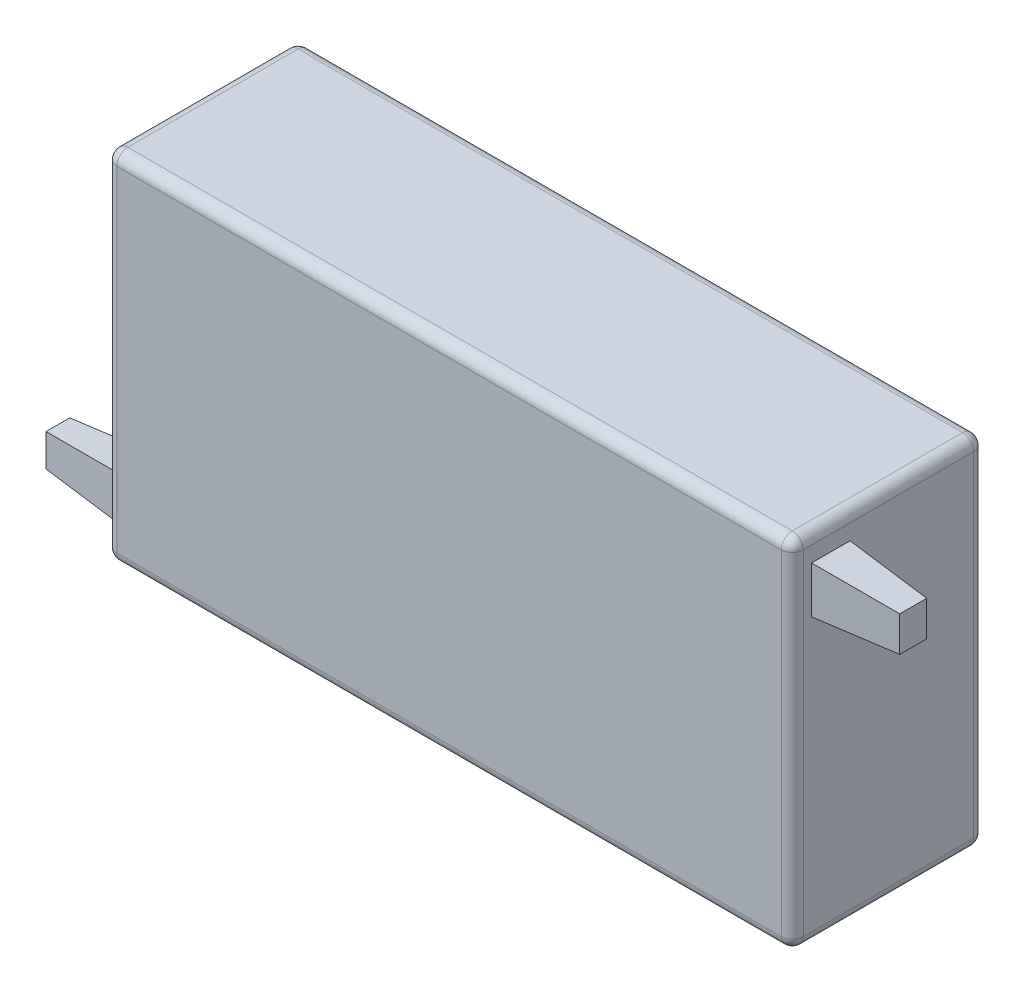
ISO-10303-21;
HEADER;
FILE_DESCRIPTION(('STEP AP214'),'2;1');
FILE_NAME('part.step','',(''),(''),'','','');
FILE_SCHEMA(('AUTOMOTIVE_DESIGN { 1 0 10303 214 1 1 1 1 }'));
ENDSEC;
DATA;
#1=APPLICATION_CONTEXT('core data for automotive mechanical design processes');
#2=APPLICATION_PROTOCOL_DEFINITION('international standard','automotive_design',2000,#1);
#3=PRODUCT_CONTEXT('',#1,'mechanical');
#4=PRODUCT('Part','Part','',(#3));
#5=PRODUCT_RELATED_PRODUCT_CATEGORY('part','',(#4));
#6=PRODUCT_DEFINITION_FORMATION('','',#4);
#7=PRODUCT_DEFINITION_CONTEXT('part definition',#1,'design');
#8=PRODUCT_DEFINITION('design','',#6,#7);
#9=PRODUCT_DEFINITION_SHAPE('','',#8);
#10=(LENGTH_UNIT() NAMED_UNIT(*) SI_UNIT(.MILLI.,.METRE.));
#11=(NAMED_UNIT(*) PLANE_ANGLE_UNIT() SI_UNIT($,.RADIAN.));
#12=(NAMED_UNIT(*) SI_UNIT($,.STERADIAN.) SOLID_ANGLE_UNIT());
#13=UNCERTAINTY_MEASURE_WITH_UNIT(LENGTH_MEASURE(1.E-05),#10,'distance_accuracy_value','');
#14=(GEOMETRIC_REPRESENTATION_CONTEXT(3) GLOBAL_UNCERTAINTY_ASSIGNED_CONTEXT((#13)) GLOBAL_UNIT_ASSIGNED_CONTEXT((#10,
#11,#12)) REPRESENTATION_CONTEXT('',''));
#15=CARTESIAN_POINT('',(0.,0.,0.));
#16=DIRECTION('',(0.,0.,1.));
#17=DIRECTION('',(1.,0.,0.));
#18=AXIS2_PLACEMENT_3D('',#15,#16,#17);
#19=CARTESIAN_POINT('',(-62.5,32.5,35.));
#20=DIRECTION('',(1.,0.,0.));
#21=DIRECTION('',(0.,0.,-1.));
#22=AXIS2_PLACEMENT_3D('',#19,#20,#21);
#23=PLANE('',#22);
#24=DIRECTION('',(0.,0.,-1.));
#25=VECTOR('',#24,1.);
#26=CARTESIAN_POINT('',(-62.5,30.5,35.));
#27=LINE('',#26,#25);
#28=CARTESIAN_POINT('',(-62.5,30.5,33.));
#29=VERTEX_POINT('',#28);
#30=CARTESIAN_POINT('',(-62.5,30.5,2.));
#31=VERTEX_POINT('',#30);
#32=EDGE_CURVE('E268',#29,#31,#27,.T.);
#33=ORIENTED_EDGE('',*,*,#32,.T.);
#34=DIRECTION('',(0.,-1.,0.));
#35=VECTOR('',#34,1.);
#36=CARTESIAN_POINT('',(-62.5,32.5,2.));
#37=LINE('',#36,#35);
#38=CARTESIAN_POINT('',(-62.5,-30.5,2.));
#39=VERTEX_POINT('',#38);
#40=EDGE_CURVE('E270',#31,#39,#37,.T.);
#41=ORIENTED_EDGE('',*,*,#40,.T.);
#42=DIRECTION('',(0.,0.,-1.));
#43=VECTOR('',#42,1.);
#44=CARTESIAN_POINT('',(-62.5,-30.5,35.));
#45=LINE('',#44,#43);
#46=CARTESIAN_POINT('',(-62.5,-30.5,33.));
#47=VERTEX_POINT('',#46);
#48=EDGE_CURVE('E266',#39,#47,#45,.F.);
#49=ORIENTED_EDGE('',*,*,#48,.T.);
#50=DIRECTION('',(0.,-1.,0.));
#51=VECTOR('',#50,1.);
#52=CARTESIAN_POINT('',(-62.5,32.5,33.));
#53=LINE('',#52,#51);
#54=EDGE_CURVE('E264',#47,#29,#53,.F.);
#55=ORIENTED_EDGE('',*,*,#54,.T.);
#56=EDGE_LOOP('',(#33,#41,#49,#55));
#57=FACE_BOUND('',#56,.T.);
#58=DIRECTION('',(0.,1.,0.));
#59=VECTOR('',#58,1.);
#60=CARTESIAN_POINT('',(-62.5,-28.8316393406113,31.9577134972738));
#61=LINE('',#60,#59);
#62=CARTESIAN_POINT('',(-62.5,-28.8316393406113,31.9577134972738));
#63=VERTEX_POINT('',#62);
#64=CARTESIAN_POINT('',(-62.5,-20.8282634696388,31.9577134972738));
#65=VERTEX_POINT('',#64);
#66=EDGE_CURVE('E168',#63,#65,#61,.T.);
#67=ORIENTED_EDGE('',*,*,#66,.F.);
#68=DIRECTION('',(0.,0.,1.));
#69=VECTOR('',#68,1.);
#70=CARTESIAN_POINT('',(-62.5,-28.8316393406113,31.9577134972738));
#71=LINE('',#70,#69);
#72=CARTESIAN_POINT('',(-62.5,-28.8316393406113,25.531800502236));
#73=VERTEX_POINT('',#72);
#74=EDGE_CURVE('E170',#73,#63,#71,.T.);
#75=ORIENTED_EDGE('',*,*,#74,.F.);
#76=DIRECTION('',(0.,-1.,0.));
#77=VECTOR('',#76,1.);
#78=CARTESIAN_POINT('',(-62.5,-28.8316393406113,25.531800502236));
#79=LINE('',#78,#77);
#80=CARTESIAN_POINT('',(-62.5,-20.8282634696388,25.531800502236));
#81=VERTEX_POINT('',#80);
#82=EDGE_CURVE('E55',#81,#73,#79,.T.);
#83=ORIENTED_EDGE('',*,*,#82,.F.);
#84=DIRECTION('',(0.,0.,-1.));
#85=VECTOR('',#84,1.);
#86=CARTESIAN_POINT('',(-62.5,-20.8282634696388,31.9577134972738));
#87=LINE('',#86,#85);
#88=EDGE_CURVE('E50',#65,#81,#87,.T.);
#89=ORIENTED_EDGE('',*,*,#88,.F.);
#90=EDGE_LOOP('',(#67,#75,#83,#89));
#91=FACE_BOUND('',#90,.T.);
#92=ADVANCED_FACE('F33',(#57,#91),#23,.F.);
#93=CARTESIAN_POINT('',(62.5,32.5,35.));
#94=DIRECTION('',(-1.,0.,0.));
#95=DIRECTION('',(0.,0.,1.));
#96=AXIS2_PLACEMENT_3D('',#93,#94,#95);
#97=PLANE('',#96);
#98=DIRECTION('',(0.,0.,-1.));
#99=VECTOR('',#98,1.);
#100=CARTESIAN_POINT('',(62.5,-30.5,35.));
#101=LINE('',#100,#99);
#102=CARTESIAN_POINT('',(62.5,-30.5,33.));
#103=VERTEX_POINT('',#102);
#104=CARTESIAN_POINT('',(62.5,-30.5,2.));
#105=VERTEX_POINT('',#104);
#106=EDGE_CURVE('E239',#103,#105,#101,.T.);
#107=ORIENTED_EDGE('',*,*,#106,.T.);
#108=DIRECTION('',(0.,1.,0.));
#109=VECTOR('',#108,1.);
#110=CARTESIAN_POINT('',(62.5,32.5,2.));
#111=LINE('',#110,#109);
#112=CARTESIAN_POINT('',(62.5,30.5,2.));
#113=VERTEX_POINT('',#112);
#114=EDGE_CURVE('E243',#105,#113,#111,.T.);
#115=ORIENTED_EDGE('',*,*,#114,.T.);
#116=DIRECTION('',(0.,0.,-1.));
#117=VECTOR('',#116,1.);
#118=CARTESIAN_POINT('',(62.5,30.5,35.));
#119=LINE('',#118,#117);
#120=CARTESIAN_POINT('',(62.5,30.5,33.));
#121=VERTEX_POINT('',#120);
#122=EDGE_CURVE('E241',#113,#121,#119,.F.);
#123=ORIENTED_EDGE('',*,*,#122,.T.);
#124=DIRECTION('',(0.,1.,0.));
#125=VECTOR('',#124,1.);
#126=CARTESIAN_POINT('',(62.5,-32.5,33.));
#127=LINE('',#126,#125);
#128=EDGE_CURVE('E237',#121,#103,#127,.F.);
#129=ORIENTED_EDGE('',*,*,#128,.T.);
#130=EDGE_LOOP('',(#107,#115,#123,#129));
#131=FACE_BOUND('',#130,.T.);
#132=DIRECTION('',(0.,-1.,0.));
#133=VECTOR('',#132,1.);
#134=CARTESIAN_POINT('',(62.5,27.6793141727861,31.4772536163314));
#135=LINE('',#134,#133);
#136=CARTESIAN_POINT('',(62.5,27.6793141727861,31.4772536163314));
#137=VERTEX_POINT('',#136);
#138=CARTESIAN_POINT('',(62.5,19.1793141727861,31.4772536163314));
#139=VERTEX_POINT('',#138);
#140=EDGE_CURVE('E203',#137,#139,#135,.T.);
#141=ORIENTED_EDGE('',*,*,#140,.F.);
#142=DIRECTION('',(0.,0.,1.));
#143=VECTOR('',#142,1.);
#144=CARTESIAN_POINT('',(62.5,27.6793141727861,31.4772536163314));
#145=LINE('',#144,#143);
#146=CARTESIAN_POINT('',(62.5,27.6793141727861,24.4772536163314));
#147=VERTEX_POINT('',#146);
#148=EDGE_CURVE('E212',#147,#137,#145,.T.);
#149=ORIENTED_EDGE('',*,*,#148,.F.);
#150=DIRECTION('',(0.,1.,0.));
#151=VECTOR('',#150,1.);
#152=CARTESIAN_POINT('',(62.5,27.6793141727861,24.4772536163314));
#153=LINE('',#152,#151);
#154=CARTESIAN_POINT('',(62.5,19.179314172786,24.4772536163314));
#155=VERTEX_POINT('',#154);
#156=EDGE_CURVE('E209',#155,#147,#153,.T.);
#157=ORIENTED_EDGE('',*,*,#156,.F.);
#158=DIRECTION('',(0.,0.,-1.));
#159=VECTOR('',#158,1.);
#160=CARTESIAN_POINT('',(62.5,19.1793141727861,31.4772536163314));
#161=LINE('',#160,#159);
#162=EDGE_CURVE('E206',#139,#155,#161,.T.);
#163=ORIENTED_EDGE('',*,*,#162,.F.);
#164=EDGE_LOOP('',(#141,#149,#157,#163));
#165=FACE_BOUND('',#164,.T.);
#166=ADVANCED_FACE('F431',(#131,#165),#97,.F.);
#167=CARTESIAN_POINT('',(-62.5,32.5,35.));
#168=DIRECTION('',(0.,-1.,0.));
#169=DIRECTION('',(0.,0.,-1.));
#170=AXIS2_PLACEMENT_3D('',#167,#168,#169);
#171=PLANE('',#170);
#172=DIRECTION('',(0.,0.,-1.));
#173=VECTOR('',#172,1.);
#174=CARTESIAN_POINT('',(60.5,32.5,35.));
#175=LINE('',#174,#173);
#176=CARTESIAN_POINT('',(60.5,32.5,33.));
#177=VERTEX_POINT('',#176);
#178=CARTESIAN_POINT('',(60.5,32.5,2.));
#179=VERTEX_POINT('',#178);
#180=EDGE_CURVE('E275',#177,#179,#175,.T.);
#181=ORIENTED_EDGE('',*,*,#180,.T.);
#182=DIRECTION('',(-1.,0.,0.));
#183=VECTOR('',#182,1.);
#184=CARTESIAN_POINT('',(-62.5,32.5,2.));
#185=LINE('',#184,#183);
#186=CARTESIAN_POINT('',(-60.5,32.5,2.));
#187=VERTEX_POINT('',#186);
#188=EDGE_CURVE('E279',#179,#187,#185,.T.);
#189=ORIENTED_EDGE('',*,*,#188,.T.);
#190=DIRECTION('',(0.,0.,-1.));
#191=VECTOR('',#190,1.);
#192=CARTESIAN_POINT('',(-60.5,32.5,35.));
#193=LINE('',#192,#191);
#194=CARTESIAN_POINT('',(-60.5,32.5,33.));
#195=VERTEX_POINT('',#194);
#196=EDGE_CURVE('E277',#187,#195,#193,.F.);
#197=ORIENTED_EDGE('',*,*,#196,.T.);
#198=DIRECTION('',(-1.,0.,0.));
#199=VECTOR('',#198,1.);
#200=CARTESIAN_POINT('',(62.5,32.5,33.));
#201=LINE('',#200,#199);
#202=EDGE_CURVE('E273',#195,#177,#201,.F.);
#203=ORIENTED_EDGE('',*,*,#202,.T.);
#204=EDGE_LOOP('',(#181,#189,#197,#203));
#205=FACE_BOUND('',#204,.T.);
#206=ADVANCED_FACE('F436',(#205),#171,.F.);
#207=CARTESIAN_POINT('',(-62.5,-32.5,35.));
#208=DIRECTION('',(0.,1.,0.));
#209=DIRECTION('',(0.,0.,1.));
#210=AXIS2_PLACEMENT_3D('',#207,#208,#209);
#211=PLANE('',#210);
#212=DIRECTION('',(0.,0.,-1.));
#213=VECTOR('',#212,1.);
#214=CARTESIAN_POINT('',(-60.5,-32.5,35.));
#215=LINE('',#214,#213);
#216=CARTESIAN_POINT('',(-60.5,-32.5,33.));
#217=VERTEX_POINT('',#216);
#218=CARTESIAN_POINT('',(-60.5,-32.5,2.));
#219=VERTEX_POINT('',#218);
#220=EDGE_CURVE('E259',#217,#219,#215,.T.);
#221=ORIENTED_EDGE('',*,*,#220,.T.);
#222=DIRECTION('',(1.,0.,0.));
#223=VECTOR('',#222,1.);
#224=CARTESIAN_POINT('',(-62.5,-32.5,2.));
#225=LINE('',#224,#223);
#226=CARTESIAN_POINT('',(60.5,-32.5,2.));
#227=VERTEX_POINT('',#226);
#228=EDGE_CURVE('E261',#219,#227,#225,.T.);
#229=ORIENTED_EDGE('',*,*,#228,.T.);
#230=DIRECTION('',(0.,0.,-1.));
#231=VECTOR('',#230,1.);
#232=CARTESIAN_POINT('',(60.5,-32.5,35.));
#233=LINE('',#232,#231);
#234=CARTESIAN_POINT('',(60.5,-32.5,33.));
#235=VERTEX_POINT('',#234);
#236=EDGE_CURVE('E257',#227,#235,#233,.F.);
#237=ORIENTED_EDGE('',*,*,#236,.T.);
#238=DIRECTION('',(1.,0.,0.));
#239=VECTOR('',#238,1.);
#240=CARTESIAN_POINT('',(-62.5,-32.5,33.));
#241=LINE('',#240,#239);
#242=EDGE_CURVE('E255',#235,#217,#241,.F.);
#243=ORIENTED_EDGE('',*,*,#242,.T.);
#244=EDGE_LOOP('',(#221,#229,#237,#243));
#245=FACE_BOUND('',#244,.T.);
#246=ADVANCED_FACE('F368',(#245),#211,.F.);
#247=CARTESIAN_POINT('',(0.,0.,35.));
#248=DIRECTION('',(0.,0.,1.));
#249=DIRECTION('',(1.,0.,0.));
#250=AXIS2_PLACEMENT_3D('',#247,#248,#249);
#251=PLANE('',#250);
#252=DIRECTION('',(0.,1.,0.));
#253=VECTOR('',#252,1.);
#254=CARTESIAN_POINT('',(60.5,32.5,35.));
#255=LINE('',#254,#253);
#256=CARTESIAN_POINT('',(60.5,-30.5,35.));
#257=VERTEX_POINT('',#256);
#258=CARTESIAN_POINT('',(60.5,30.5,35.));
#259=VERTEX_POINT('',#258);
#260=EDGE_CURVE('E42',#257,#259,#255,.T.);
#261=ORIENTED_EDGE('',*,*,#260,.T.);
#262=DIRECTION('',(-1.,0.,0.));
#263=VECTOR('',#262,1.);
#264=CARTESIAN_POINT('',(-62.5,30.5,35.));
#265=LINE('',#264,#263);
#266=CARTESIAN_POINT('',(-60.5,30.5,35.));
#267=VERTEX_POINT('',#266);
#268=EDGE_CURVE('E11',#259,#267,#265,.T.);
#269=ORIENTED_EDGE('',*,*,#268,.T.);
#270=DIRECTION('',(0.,-1.,0.));
#271=VECTOR('',#270,1.);
#272=CARTESIAN_POINT('',(-60.5,-32.5,35.));
#273=LINE('',#272,#271);
#274=CARTESIAN_POINT('',(-60.5,-30.5,35.));
#275=VERTEX_POINT('',#274);
#276=EDGE_CURVE('E282',#267,#275,#273,.T.);
#277=ORIENTED_EDGE('',*,*,#276,.T.);
#278=DIRECTION('',(1.,0.,0.));
#279=VECTOR('',#278,1.);
#280=CARTESIAN_POINT('',(62.5,-30.5,35.));
#281=LINE('',#280,#279);
#282=EDGE_CURVE('E284',#275,#257,#281,.T.);
#283=ORIENTED_EDGE('',*,*,#282,.T.);
#284=EDGE_LOOP('',(#261,#269,#277,#283));
#285=FACE_BOUND('',#284,.T.);
#286=ADVANCED_FACE('F377',(#285),#251,.T.);
#287=CARTESIAN_POINT('',(0.,0.,0.));
#288=DIRECTION('',(0.,0.,1.));
#289=DIRECTION('',(1.,0.,0.));
#290=AXIS2_PLACEMENT_3D('',#287,#288,#289);
#291=PLANE('',#290);
#292=DIRECTION('',(-1.,0.,0.));
#293=VECTOR('',#292,1.);
#294=CARTESIAN_POINT('',(0.,30.5,0.));
#295=LINE('',#294,#293);
#296=CARTESIAN_POINT('',(-60.5,30.5,0.));
#297=VERTEX_POINT('',#296);
#298=CARTESIAN_POINT('',(60.5,30.5,0.));
#299=VERTEX_POINT('',#298);
#300=EDGE_CURVE('E246',#297,#299,#295,.F.);
#301=ORIENTED_EDGE('',*,*,#300,.T.);
#302=DIRECTION('',(0.,1.,0.));
#303=VECTOR('',#302,1.);
#304=CARTESIAN_POINT('',(60.5,0.,0.));
#305=LINE('',#304,#303);
#306=CARTESIAN_POINT('',(60.5,-30.5,0.));
#307=VERTEX_POINT('',#306);
#308=EDGE_CURVE('E252',#299,#307,#305,.F.);
#309=ORIENTED_EDGE('',*,*,#308,.T.);
#310=DIRECTION('',(1.,0.,0.));
#311=VECTOR('',#310,1.);
#312=CARTESIAN_POINT('',(0.,-30.5,0.));
#313=LINE('',#312,#311);
#314=CARTESIAN_POINT('',(-60.5,-30.5,0.));
#315=VERTEX_POINT('',#314);
#316=EDGE_CURVE('E250',#307,#315,#313,.F.);
#317=ORIENTED_EDGE('',*,*,#316,.T.);
#318=DIRECTION('',(0.,-1.,0.));
#319=VECTOR('',#318,1.);
#320=CARTESIAN_POINT('',(-60.5,0.,0.));
#321=LINE('',#320,#319);
#322=EDGE_CURVE('E248',#315,#297,#321,.F.);
#323=ORIENTED_EDGE('',*,*,#322,.T.);
#324=EDGE_LOOP('',(#301,#309,#317,#323));
#325=FACE_BOUND('',#324,.T.);
#326=ADVANCED_FACE('F478',(#325),#291,.F.);
#327=CARTESIAN_POINT('',(-60.5,0.,33.));
#328=DIRECTION('',(0.,1.,0.));
#329=DIRECTION('',(0.,0.,1.));
#330=AXIS2_PLACEMENT_3D('',#327,#328,#329);
#331=CYLINDRICAL_SURFACE('',#330,2.);
#332=CARTESIAN_POINT('',(-60.5,-30.5,33.));
#333=DIRECTION('',(0.,-1.,0.));
#334=DIRECTION('',(0.,0.,-1.));
#335=AXIS2_PLACEMENT_3D('',#332,#333,#334);
#336=CIRCLE('',#335,2.);
#337=EDGE_CURVE('E37',#275,#47,#336,.T.);
#338=ORIENTED_EDGE('',*,*,#337,.F.);
#339=ORIENTED_EDGE('',*,*,#276,.F.);
#340=CARTESIAN_POINT('',(-60.5,30.5,33.));
#341=DIRECTION('',(0.,1.,0.));
#342=DIRECTION('',(0.,0.,1.));
#343=AXIS2_PLACEMENT_3D('',#340,#341,#342);
#344=CIRCLE('',#343,2.);
#345=EDGE_CURVE('E345',#29,#267,#344,.T.);
#346=ORIENTED_EDGE('',*,*,#345,.F.);
#347=ORIENTED_EDGE('',*,*,#54,.F.);
#348=EDGE_LOOP('',(#338,#339,#346,#347));
#349=FACE_BOUND('',#348,.T.);
#350=ADVANCED_FACE('F35',(#349),#331,.T.);
#351=CARTESIAN_POINT('',(-60.5,-30.5,33.));
#352=DIRECTION('',(0.,0.,1.));
#353=DIRECTION('',(1.,0.,0.));
#354=AXIS2_PLACEMENT_3D('',#351,#352,#353);
#355=SPHERICAL_SURFACE('',#354,2.);
#356=CARTESIAN_POINT('',(-60.5,-30.5,33.));
#357=DIRECTION('',(-1.,0.,0.));
#358=DIRECTION('',(0.,0.,1.));
#359=AXIS2_PLACEMENT_3D('',#356,#357,#358);
#360=CIRCLE('',#359,2.);
#361=EDGE_CURVE('E340',#275,#217,#360,.F.);
#362=ORIENTED_EDGE('',*,*,#361,.F.);
#363=ORIENTED_EDGE('',*,*,#337,.T.);
#364=CARTESIAN_POINT('',(-60.5,-30.5,33.));
#365=DIRECTION('',(0.,0.,1.));
#366=DIRECTION('',(1.,0.,0.));
#367=AXIS2_PLACEMENT_3D('',#364,#365,#366);
#368=CIRCLE('',#367,2.);
#369=EDGE_CURVE('E343',#217,#47,#368,.F.);
#370=ORIENTED_EDGE('',*,*,#369,.F.);
#371=EDGE_LOOP('',(#362,#363,#370));
#372=FACE_BOUND('',#371,.T.);
#373=ADVANCED_FACE('F357',(#372),#355,.T.);
#374=CARTESIAN_POINT('',(-60.5,30.5,33.));
#375=DIRECTION('',(0.,0.,1.));
#376=DIRECTION('',(1.,0.,0.));
#377=AXIS2_PLACEMENT_3D('',#374,#375,#376);
#378=SPHERICAL_SURFACE('',#377,2.);
#379=CARTESIAN_POINT('',(-60.5,30.5,33.));
#380=DIRECTION('',(0.,0.,1.));
#381=DIRECTION('',(1.,0.,0.));
#382=AXIS2_PLACEMENT_3D('',#379,#380,#381);
#383=CIRCLE('',#382,2.);
#384=EDGE_CURVE('E335',#29,#195,#383,.F.);
#385=ORIENTED_EDGE('',*,*,#384,.F.);
#386=ORIENTED_EDGE('',*,*,#345,.T.);
#387=CARTESIAN_POINT('',(-60.5,30.5,33.));
#388=DIRECTION('',(-1.,0.,0.));
#389=DIRECTION('',(0.,0.,1.));
#390=AXIS2_PLACEMENT_3D('',#387,#388,#389);
#391=CIRCLE('',#390,2.);
#392=EDGE_CURVE('E338',#195,#267,#391,.F.);
#393=ORIENTED_EDGE('',*,*,#392,.F.);
#394=EDGE_LOOP('',(#385,#386,#393));
#395=FACE_BOUND('',#394,.T.);
#396=ADVANCED_FACE('F393',(#395),#378,.T.);
#397=CARTESIAN_POINT('',(-60.5,-30.5,35.));
#398=DIRECTION('',(0.,0.,-1.));
#399=DIRECTION('',(-1.,0.,0.));
#400=AXIS2_PLACEMENT_3D('',#397,#398,#399);
#401=CYLINDRICAL_SURFACE('',#400,2.);
#402=ORIENTED_EDGE('',*,*,#369,.T.);
#403=ORIENTED_EDGE('',*,*,#48,.F.);
#404=CARTESIAN_POINT('',(-60.5,-30.5,2.));
#405=DIRECTION('',(0.,0.,-1.));
#406=DIRECTION('',(-1.,0.,0.));
#407=AXIS2_PLACEMENT_3D('',#404,#405,#406);
#408=CIRCLE('',#407,2.);
#409=EDGE_CURVE('E330',#219,#39,#408,.T.);
#410=ORIENTED_EDGE('',*,*,#409,.F.);
#411=ORIENTED_EDGE('',*,*,#220,.F.);
#412=EDGE_LOOP('',(#402,#403,#410,#411));
#413=FACE_BOUND('',#412,.T.);
#414=ADVANCED_FACE('F364',(#413),#401,.T.);
#415=CARTESIAN_POINT('',(0.,-30.5,33.));
#416=DIRECTION('',(-1.,0.,0.));
#417=DIRECTION('',(0.,0.,1.));
#418=AXIS2_PLACEMENT_3D('',#415,#416,#417);
#419=CYLINDRICAL_SURFACE('',#418,2.);
#420=ORIENTED_EDGE('',*,*,#361,.T.);
#421=ORIENTED_EDGE('',*,*,#242,.F.);
#422=CARTESIAN_POINT('',(60.5,-30.5,33.));
#423=DIRECTION('',(1.,0.,0.));
#424=DIRECTION('',(0.,0.,-1.));
#425=AXIS2_PLACEMENT_3D('',#422,#423,#424);
#426=CIRCLE('',#425,2.);
#427=EDGE_CURVE('E327',#257,#235,#426,.T.);
#428=ORIENTED_EDGE('',*,*,#427,.F.);
#429=ORIENTED_EDGE('',*,*,#282,.F.);
#430=EDGE_LOOP('',(#420,#421,#428,#429));
#431=FACE_BOUND('',#430,.T.);
#432=ADVANCED_FACE('F374',(#431),#419,.T.);
#433=CARTESIAN_POINT('',(60.5,0.,33.));
#434=DIRECTION('',(0.,-1.,0.));
#435=DIRECTION('',(0.,0.,-1.));
#436=AXIS2_PLACEMENT_3D('',#433,#434,#435);
#437=CYLINDRICAL_SURFACE('',#436,2.);
#438=CARTESIAN_POINT('',(60.5,30.5,33.));
#439=DIRECTION('',(0.,1.,0.));
#440=DIRECTION('',(0.,0.,1.));
#441=AXIS2_PLACEMENT_3D('',#438,#439,#440);
#442=CIRCLE('',#441,2.);
#443=EDGE_CURVE('E321',#259,#121,#442,.T.);
#444=ORIENTED_EDGE('',*,*,#443,.F.);
#445=ORIENTED_EDGE('',*,*,#260,.F.);
#446=CARTESIAN_POINT('',(60.5,-30.5,33.));
#447=DIRECTION('',(0.,-1.,0.));
#448=DIRECTION('',(0.,0.,-1.));
#449=AXIS2_PLACEMENT_3D('',#446,#447,#448);
#450=CIRCLE('',#449,2.);
#451=EDGE_CURVE('E324',#103,#257,#450,.T.);
#452=ORIENTED_EDGE('',*,*,#451,.F.);
#453=ORIENTED_EDGE('',*,*,#128,.F.);
#454=EDGE_LOOP('',(#444,#445,#452,#453));
#455=FACE_BOUND('',#454,.T.);
#456=ADVANCED_FACE('F382',(#455),#437,.T.);
#457=CARTESIAN_POINT('',(0.,30.5,33.));
#458=DIRECTION('',(1.,0.,0.));
#459=DIRECTION('',(0.,0.,-1.));
#460=AXIS2_PLACEMENT_3D('',#457,#458,#459);
#461=CYLINDRICAL_SURFACE('',#460,2.);
#462=ORIENTED_EDGE('',*,*,#392,.T.);
#463=ORIENTED_EDGE('',*,*,#268,.F.);
#464=CARTESIAN_POINT('',(60.5,30.5,33.));
#465=DIRECTION('',(1.,0.,0.));
#466=DIRECTION('',(0.,0.,-1.));
#467=AXIS2_PLACEMENT_3D('',#464,#465,#466);
#468=CIRCLE('',#467,2.);
#469=EDGE_CURVE('E318',#177,#259,#468,.T.);
#470=ORIENTED_EDGE('',*,*,#469,.F.);
#471=ORIENTED_EDGE('',*,*,#202,.F.);
#472=EDGE_LOOP('',(#462,#463,#470,#471));
#473=FACE_BOUND('',#472,.T.);
#474=ADVANCED_FACE('F392',(#473),#461,.T.);
#475=CARTESIAN_POINT('',(-60.5,30.5,35.));
#476=DIRECTION('',(0.,0.,-1.));
#477=DIRECTION('',(-1.,0.,0.));
#478=AXIS2_PLACEMENT_3D('',#475,#476,#477);
#479=CYLINDRICAL_SURFACE('',#478,2.);
#480=ORIENTED_EDGE('',*,*,#384,.T.);
#481=ORIENTED_EDGE('',*,*,#196,.F.);
#482=CARTESIAN_POINT('',(-60.5,30.5,2.));
#483=DIRECTION('',(0.,0.,-1.));
#484=DIRECTION('',(-1.,0.,0.));
#485=AXIS2_PLACEMENT_3D('',#482,#483,#484);
#486=CIRCLE('',#485,2.);
#487=EDGE_CURVE('E315',#31,#187,#486,.T.);
#488=ORIENTED_EDGE('',*,*,#487,.F.);
#489=ORIENTED_EDGE('',*,*,#32,.F.);
#490=EDGE_LOOP('',(#480,#481,#488,#489));
#491=FACE_BOUND('',#490,.T.);
#492=ADVANCED_FACE('F398',(#491),#479,.T.);
#493=CARTESIAN_POINT('',(-60.5,32.5,2.));
#494=DIRECTION('',(0.,-1.,0.));
#495=DIRECTION('',(0.,0.,-1.));
#496=AXIS2_PLACEMENT_3D('',#493,#494,#495);
#497=CYLINDRICAL_SURFACE('',#496,2.);
#498=CARTESIAN_POINT('',(-60.5,-30.5,2.));
#499=DIRECTION('',(0.,-1.,0.));
#500=DIRECTION('',(0.,0.,-1.));
#501=AXIS2_PLACEMENT_3D('',#498,#499,#500);
#502=CIRCLE('',#501,2.);
#503=EDGE_CURVE('E332',#39,#315,#502,.T.);
#504=ORIENTED_EDGE('',*,*,#503,.F.);
#505=ORIENTED_EDGE('',*,*,#40,.F.);
#506=CARTESIAN_POINT('',(-60.5,30.5,2.));
#507=DIRECTION('',(0.,1.,0.));
#508=DIRECTION('',(0.,0.,1.));
#509=AXIS2_PLACEMENT_3D('',#506,#507,#508);
#510=CIRCLE('',#509,2.);
#511=EDGE_CURVE('E312',#297,#31,#510,.T.);
#512=ORIENTED_EDGE('',*,*,#511,.F.);
#513=ORIENTED_EDGE('',*,*,#322,.F.);
#514=EDGE_LOOP('',(#504,#505,#512,#513));
#515=FACE_BOUND('',#514,.T.);
#516=ADVANCED_FACE('F404',(#515),#497,.T.);
#517=CARTESIAN_POINT('',(-60.5,-30.5,2.));
#518=DIRECTION('',(0.,0.,1.));
#519=DIRECTION('',(1.,0.,0.));
#520=AXIS2_PLACEMENT_3D('',#517,#518,#519);
#521=SPHERICAL_SURFACE('',#520,2.);
#522=ORIENTED_EDGE('',*,*,#409,.T.);
#523=ORIENTED_EDGE('',*,*,#503,.T.);
#524=CARTESIAN_POINT('',(-60.5,-30.5,2.));
#525=DIRECTION('',(-1.,0.,0.));
#526=DIRECTION('',(0.,0.,1.));
#527=AXIS2_PLACEMENT_3D('',#524,#525,#526);
#528=CIRCLE('',#527,2.);
#529=EDGE_CURVE('E309',#219,#315,#528,.F.);
#530=ORIENTED_EDGE('',*,*,#529,.F.);
#531=EDGE_LOOP('',(#522,#523,#530));
#532=FACE_BOUND('',#531,.T.);
#533=ADVANCED_FACE('F408',(#532),#521,.T.);
#534=CARTESIAN_POINT('',(60.5,-30.5,33.));
#535=DIRECTION('',(0.,0.,1.));
#536=DIRECTION('',(1.,0.,0.));
#537=AXIS2_PLACEMENT_3D('',#534,#535,#536);
#538=SPHERICAL_SURFACE('',#537,2.);
#539=ORIENTED_EDGE('',*,*,#451,.T.);
#540=ORIENTED_EDGE('',*,*,#427,.T.);
#541=CARTESIAN_POINT('',(60.5,-30.5,33.));
#542=DIRECTION('',(0.,0.,1.));
#543=DIRECTION('',(1.,0.,0.));
#544=AXIS2_PLACEMENT_3D('',#541,#542,#543);
#545=CIRCLE('',#544,2.);
#546=EDGE_CURVE('E306',#103,#235,#545,.F.);
#547=ORIENTED_EDGE('',*,*,#546,.F.);
#548=EDGE_LOOP('',(#539,#540,#547));
#549=FACE_BOUND('',#548,.T.);
#550=ADVANCED_FACE('F420',(#549),#538,.T.);
#551=CARTESIAN_POINT('',(60.5,30.5,33.));
#552=DIRECTION('',(0.,0.,1.));
#553=DIRECTION('',(1.,0.,0.));
#554=AXIS2_PLACEMENT_3D('',#551,#552,#553);
#555=SPHERICAL_SURFACE('',#554,2.);
#556=ORIENTED_EDGE('',*,*,#469,.T.);
#557=ORIENTED_EDGE('',*,*,#443,.T.);
#558=CARTESIAN_POINT('',(60.5,30.5,33.));
#559=DIRECTION('',(0.,0.,1.));
#560=DIRECTION('',(1.,0.,0.));
#561=AXIS2_PLACEMENT_3D('',#558,#559,#560);
#562=CIRCLE('',#561,2.);
#563=EDGE_CURVE('E303',#177,#121,#562,.F.);
#564=ORIENTED_EDGE('',*,*,#563,.F.);
#565=EDGE_LOOP('',(#556,#557,#564));
#566=FACE_BOUND('',#565,.T.);
#567=ADVANCED_FACE('F388',(#566),#555,.T.);
#568=CARTESIAN_POINT('',(-60.5,30.5,2.));
#569=DIRECTION('',(0.,0.,1.));
#570=DIRECTION('',(1.,0.,0.));
#571=AXIS2_PLACEMENT_3D('',#568,#569,#570);
#572=SPHERICAL_SURFACE('',#571,2.);
#573=ORIENTED_EDGE('',*,*,#511,.T.);
#574=ORIENTED_EDGE('',*,*,#487,.T.);
#575=CARTESIAN_POINT('',(-60.5,30.5,2.));
#576=DIRECTION('',(-1.,0.,0.));
#577=DIRECTION('',(0.,0.,1.));
#578=AXIS2_PLACEMENT_3D('',#575,#576,#577);
#579=CIRCLE('',#578,2.);
#580=EDGE_CURVE('E301',#297,#187,#579,.F.);
#581=ORIENTED_EDGE('',*,*,#580,.F.);
#582=EDGE_LOOP('',(#573,#574,#581));
#583=FACE_BOUND('',#582,.T.);
#584=ADVANCED_FACE('F427',(#583),#572,.T.);
#585=CARTESIAN_POINT('',(-62.5,-30.5,2.));
#586=DIRECTION('',(1.,0.,0.));
#587=DIRECTION('',(0.,0.,-1.));
#588=AXIS2_PLACEMENT_3D('',#585,#586,#587);
#589=CYLINDRICAL_SURFACE('',#588,2.);
#590=ORIENTED_EDGE('',*,*,#529,.T.);
#591=ORIENTED_EDGE('',*,*,#316,.F.);
#592=CARTESIAN_POINT('',(60.5,-30.5,2.));
#593=DIRECTION('',(1.,0.,0.));
#594=DIRECTION('',(0.,0.,-1.));
#595=AXIS2_PLACEMENT_3D('',#592,#593,#594);
#596=CIRCLE('',#595,2.);
#597=EDGE_CURVE('E298',#227,#307,#596,.T.);
#598=ORIENTED_EDGE('',*,*,#597,.F.);
#599=ORIENTED_EDGE('',*,*,#228,.F.);
#600=EDGE_LOOP('',(#590,#591,#598,#599));
#601=FACE_BOUND('',#600,.T.);
#602=ADVANCED_FACE('F411',(#601),#589,.T.);
#603=CARTESIAN_POINT('',(60.5,-30.5,35.));
#604=DIRECTION('',(0.,0.,-1.));
#605=DIRECTION('',(-1.,0.,0.));
#606=AXIS2_PLACEMENT_3D('',#603,#604,#605);
#607=CYLINDRICAL_SURFACE('',#606,2.);
#608=ORIENTED_EDGE('',*,*,#546,.T.);
#609=ORIENTED_EDGE('',*,*,#236,.F.);
#610=CARTESIAN_POINT('',(60.5,-30.5,2.));
#611=DIRECTION('',(0.,0.,-1.));
#612=DIRECTION('',(-1.,0.,0.));
#613=AXIS2_PLACEMENT_3D('',#610,#611,#612);
#614=CIRCLE('',#613,2.);
#615=EDGE_CURVE('E296',#105,#227,#614,.T.);
#616=ORIENTED_EDGE('',*,*,#615,.F.);
#617=ORIENTED_EDGE('',*,*,#106,.F.);
#618=EDGE_LOOP('',(#608,#609,#616,#617));
#619=FACE_BOUND('',#618,.T.);
#620=ADVANCED_FACE('F417',(#619),#607,.T.);
#621=CARTESIAN_POINT('',(60.5,30.5,35.));
#622=DIRECTION('',(0.,0.,-1.));
#623=DIRECTION('',(-1.,0.,0.));
#624=AXIS2_PLACEMENT_3D('',#621,#622,#623);
#625=CYLINDRICAL_SURFACE('',#624,2.);
#626=ORIENTED_EDGE('',*,*,#563,.T.);
#627=ORIENTED_EDGE('',*,*,#122,.F.);
#628=CARTESIAN_POINT('',(60.5,30.5,2.));
#629=DIRECTION('',(0.,0.,-1.));
#630=DIRECTION('',(-1.,0.,0.));
#631=AXIS2_PLACEMENT_3D('',#628,#629,#630);
#632=CIRCLE('',#631,2.);
#633=EDGE_CURVE('E293',#179,#113,#632,.T.);
#634=ORIENTED_EDGE('',*,*,#633,.F.);
#635=ORIENTED_EDGE('',*,*,#180,.F.);
#636=EDGE_LOOP('',(#626,#627,#634,#635));
#637=FACE_BOUND('',#636,.T.);
#638=ADVANCED_FACE('F460',(#637),#625,.T.);
#639=CARTESIAN_POINT('',(-62.5,30.5,2.));
#640=DIRECTION('',(-1.,0.,0.));
#641=DIRECTION('',(0.,0.,1.));
#642=AXIS2_PLACEMENT_3D('',#639,#640,#641);
#643=CYLINDRICAL_SURFACE('',#642,2.);
#644=ORIENTED_EDGE('',*,*,#580,.T.);
#645=ORIENTED_EDGE('',*,*,#188,.F.);
#646=CARTESIAN_POINT('',(60.5,30.5,2.));
#647=DIRECTION('',(1.,0.,0.));
#648=DIRECTION('',(0.,0.,-1.));
#649=AXIS2_PLACEMENT_3D('',#646,#647,#648);
#650=CIRCLE('',#649,2.);
#651=EDGE_CURVE('E290',#299,#179,#650,.T.);
#652=ORIENTED_EDGE('',*,*,#651,.F.);
#653=ORIENTED_EDGE('',*,*,#300,.F.);
#654=EDGE_LOOP('',(#644,#645,#652,#653));
#655=FACE_BOUND('',#654,.T.);
#656=ADVANCED_FACE('F457',(#655),#643,.T.);
#657=CARTESIAN_POINT('',(60.5,-30.5,2.));
#658=DIRECTION('',(0.,0.,1.));
#659=DIRECTION('',(1.,0.,0.));
#660=AXIS2_PLACEMENT_3D('',#657,#658,#659);
#661=SPHERICAL_SURFACE('',#660,2.);
#662=ORIENTED_EDGE('',*,*,#615,.T.);
#663=ORIENTED_EDGE('',*,*,#597,.T.);
#664=CARTESIAN_POINT('',(60.5,-30.5,2.));
#665=DIRECTION('',(0.,-1.,0.));
#666=DIRECTION('',(1.,0.,0.));
#667=AXIS2_PLACEMENT_3D('',#664,#665,#666);
#668=CIRCLE('',#667,2.);
#669=EDGE_CURVE('E288',#105,#307,#668,.F.);
#670=ORIENTED_EDGE('',*,*,#669,.F.);
#671=EDGE_LOOP('',(#662,#663,#670));
#672=FACE_BOUND('',#671,.T.);
#673=ADVANCED_FACE('F453',(#672),#661,.T.);
#674=CARTESIAN_POINT('',(60.5,30.5,2.));
#675=DIRECTION('',(0.,0.,1.));
#676=DIRECTION('',(1.,0.,0.));
#677=AXIS2_PLACEMENT_3D('',#674,#675,#676);
#678=SPHERICAL_SURFACE('',#677,2.);
#679=ORIENTED_EDGE('',*,*,#651,.T.);
#680=ORIENTED_EDGE('',*,*,#633,.T.);
#681=CARTESIAN_POINT('',(60.5,30.5,2.));
#682=DIRECTION('',(0.,1.,0.));
#683=DIRECTION('',(0.,0.,1.));
#684=AXIS2_PLACEMENT_3D('',#681,#682,#683);
#685=CIRCLE('',#684,2.);
#686=EDGE_CURVE('E219',#299,#113,#685,.F.);
#687=ORIENTED_EDGE('',*,*,#686,.F.);
#688=EDGE_LOOP('',(#679,#680,#687));
#689=FACE_BOUND('',#688,.T.);
#690=ADVANCED_FACE('F449',(#689),#678,.T.);
#691=CARTESIAN_POINT('',(60.5,32.5,2.));
#692=DIRECTION('',(0.,1.,0.));
#693=DIRECTION('',(0.,0.,1.));
#694=AXIS2_PLACEMENT_3D('',#691,#692,#693);
#695=CYLINDRICAL_SURFACE('',#694,2.);
#696=ORIENTED_EDGE('',*,*,#669,.T.);
#697=ORIENTED_EDGE('',*,*,#308,.F.);
#698=ORIENTED_EDGE('',*,*,#686,.T.);
#699=ORIENTED_EDGE('',*,*,#114,.F.);
#700=EDGE_LOOP('',(#696,#697,#698,#699));
#701=FACE_BOUND('',#700,.T.);
#702=ADVANCED_FACE('F445',(#701),#695,.T.);
#703=CARTESIAN_POINT('',(62.5,27.6793141727861,31.4772536163314));
#704=DIRECTION('',(0.0697564737441253,0.,0.997564050259824));
#705=DIRECTION('',(0.997564050259824,0.,-0.0697564737441253));
#706=AXIS2_PLACEMENT_3D('',#703,#704,#705);
#707=PLANE('',#706);
#708=ORIENTED_EDGE('',*,*,#140,.T.);
#709=DIRECTION('',(-0.995145815783509,-0.0695873743166647,0.0695873743166647));
#710=VECTOR('',#709,1.);
#711=CARTESIAN_POINT('',(62.5,19.1793141727861,31.4772536163314));
#712=LINE('',#711,#710);
#713=CARTESIAN_POINT('',(77.5,20.2282163519387,30.4283514371788));
#714=VERTEX_POINT('',#713);
#715=EDGE_CURVE('E216',#714,#139,#712,.T.);
#716=ORIENTED_EDGE('',*,*,#715,.F.);
#717=DIRECTION('',(0.,1.,0.));
#718=VECTOR('',#717,1.);
#719=CARTESIAN_POINT('',(77.5,27.6793141727861,30.4283514371788));
#720=LINE('',#719,#718);
#721=CARTESIAN_POINT('',(77.5,26.6304119936334,30.4283514371788));
#722=VERTEX_POINT('',#721);
#723=EDGE_CURVE('E215',#722,#714,#720,.F.);
#724=ORIENTED_EDGE('',*,*,#723,.F.);
#725=DIRECTION('',(-0.995145815783509,0.0695873743166647,0.0695873743166647));
#726=VECTOR('',#725,1.);
#727=CARTESIAN_POINT('',(62.5,27.6793141727861,31.4772536163314));
#728=LINE('',#727,#726);
#729=EDGE_CURVE('E221',#722,#137,#728,.T.);
#730=ORIENTED_EDGE('',*,*,#729,.T.);
#731=EDGE_LOOP('',(#708,#716,#724,#730));
#732=FACE_BOUND('',#731,.T.);
#733=ADVANCED_FACE('F448',(#732),#707,.T.);
#734=CARTESIAN_POINT('',(62.5,19.1793141727861,31.4772536163314));
#735=DIRECTION('',(0.0697564737441253,-0.997564050259824,0.));
#736=DIRECTION('',(0.997564050259824,0.0697564737441254,0.));
#737=AXIS2_PLACEMENT_3D('',#734,#735,#736);
#738=PLANE('',#737);
#739=ORIENTED_EDGE('',*,*,#162,.T.);
#740=DIRECTION('',(-0.995145815783509,-0.0695873743166647,-0.0695873743166647));
#741=VECTOR('',#740,1.);
#742=CARTESIAN_POINT('',(63.088621467252,19.2204745954325,24.5184140389779));
#743=LINE('',#742,#741);
#744=CARTESIAN_POINT('',(77.5,20.2282163519387,25.5261557954841));
#745=VERTEX_POINT('',#744);
#746=EDGE_CURVE('E220',#745,#155,#743,.T.);
#747=ORIENTED_EDGE('',*,*,#746,.F.);
#748=DIRECTION('',(0.,0.,1.));
#749=VECTOR('',#748,1.);
#750=CARTESIAN_POINT('',(77.5,20.2282163519387,31.4772536163314));
#751=LINE('',#750,#749);
#752=EDGE_CURVE('E232',#714,#745,#751,.F.);
#753=ORIENTED_EDGE('',*,*,#752,.F.);
#754=ORIENTED_EDGE('',*,*,#715,.T.);
#755=EDGE_LOOP('',(#739,#747,#753,#754));
#756=FACE_BOUND('',#755,.T.);
#757=ADVANCED_FACE('F499',(#756),#738,.T.);
#758=CARTESIAN_POINT('',(62.5,27.6793141727861,24.4772536163314));
#759=DIRECTION('',(0.0697564737441253,0.,-0.997564050259824));
#760=DIRECTION('',(-0.997564050259824,0.,-0.0697564737441253));
#761=AXIS2_PLACEMENT_3D('',#758,#759,#760);
#762=PLANE('',#761);
#763=ORIENTED_EDGE('',*,*,#156,.T.);
#764=DIRECTION('',(-0.995145815783509,0.0695873743166647,-0.0695873743166647));
#765=VECTOR('',#764,1.);
#766=CARTESIAN_POINT('',(62.9847470906781,27.645417354136,24.5111504349815));
#767=LINE('',#766,#765);
#768=CARTESIAN_POINT('',(77.5,26.6304119936334,25.5261557954841));
#769=VERTEX_POINT('',#768);
#770=EDGE_CURVE('E224',#769,#147,#767,.T.);
#771=ORIENTED_EDGE('',*,*,#770,.F.);
#772=DIRECTION('',(0.,-1.,0.));
#773=VECTOR('',#772,1.);
#774=CARTESIAN_POINT('',(77.5,27.6793141727861,25.5261557954841));
#775=LINE('',#774,#773);
#776=EDGE_CURVE('E234',#745,#769,#775,.F.);
#777=ORIENTED_EDGE('',*,*,#776,.F.);
#778=ORIENTED_EDGE('',*,*,#746,.T.);
#779=EDGE_LOOP('',(#763,#771,#777,#778));
#780=FACE_BOUND('',#779,.T.);
#781=ADVANCED_FACE('F497',(#780),#762,.T.);
#782=CARTESIAN_POINT('',(62.5,27.6793141727861,31.4772536163314));
#783=DIRECTION('',(0.0697564737441253,0.997564050259824,0.));
#784=DIRECTION('',(-0.997564050259824,0.0697564737441254,0.));
#785=AXIS2_PLACEMENT_3D('',#782,#783,#784);
#786=PLANE('',#785);
#787=ORIENTED_EDGE('',*,*,#148,.T.);
#788=ORIENTED_EDGE('',*,*,#729,.F.);
#789=DIRECTION('',(0.,0.,-1.));
#790=VECTOR('',#789,1.);
#791=CARTESIAN_POINT('',(77.5,26.6304119936334,31.4772536163314));
#792=LINE('',#791,#790);
#793=EDGE_CURVE('E225',#769,#722,#792,.F.);
#794=ORIENTED_EDGE('',*,*,#793,.F.);
#795=ORIENTED_EDGE('',*,*,#770,.T.);
#796=EDGE_LOOP('',(#787,#788,#794,#795));
#797=FACE_BOUND('',#796,.T.);
#798=ADVANCED_FACE('F488',(#797),#786,.T.);
#799=CARTESIAN_POINT('',(77.5,0.,0.));
#800=DIRECTION('',(1.,0.,0.));
#801=DIRECTION('',(0.,0.,-1.));
#802=AXIS2_PLACEMENT_3D('',#799,#800,#801);
#803=PLANE('',#802);
#804=ORIENTED_EDGE('',*,*,#723,.T.);
#805=ORIENTED_EDGE('',*,*,#752,.T.);
#806=ORIENTED_EDGE('',*,*,#776,.T.);
#807=ORIENTED_EDGE('',*,*,#793,.T.);
#808=EDGE_LOOP('',(#804,#805,#806,#807));
#809=FACE_BOUND('',#808,.T.);
#810=ADVANCED_FACE('F493',(#809),#803,.T.);
#811=CARTESIAN_POINT('',(-62.5,-28.8316393406113,31.9577134972738));
#812=DIRECTION('',(-0.0697564737441253,0.,0.997564050259824));
#813=DIRECTION('',(0.997564050259824,0.,0.0697564737441253));
#814=AXIS2_PLACEMENT_3D('',#811,#812,#813);
#815=PLANE('',#814);
#816=ORIENTED_EDGE('',*,*,#66,.T.);
#817=DIRECTION('',(0.995145815783508,0.0695873743166647,0.0695873743166647));
#818=VECTOR('',#817,1.);
#819=CARTESIAN_POINT('',(-62.5,-20.8282634696388,31.9577134972738));
#820=LINE('',#819,#818);
#821=CARTESIAN_POINT('',(-77.5,-21.8771656487915,30.9088113181212));
#822=VERTEX_POINT('',#821);
#823=EDGE_CURVE('E195',#822,#65,#820,.T.);
#824=ORIENTED_EDGE('',*,*,#823,.F.);
#825=DIRECTION('',(0.,-1.,0.));
#826=VECTOR('',#825,1.);
#827=CARTESIAN_POINT('',(-77.5,-28.8316393406113,30.9088113181212));
#828=LINE('',#827,#826);
#829=CARTESIAN_POINT('',(-77.5,-27.7827371614586,30.9088113181212));
#830=VERTEX_POINT('',#829);
#831=EDGE_CURVE('E184',#830,#822,#828,.F.);
#832=ORIENTED_EDGE('',*,*,#831,.F.);
#833=DIRECTION('',(0.995145815783508,-0.0695873743166647,0.0695873743166647));
#834=VECTOR('',#833,1.);
#835=CARTESIAN_POINT('',(-62.5,-28.8316393406113,31.9577134972738));
#836=LINE('',#835,#834);
#837=EDGE_CURVE('E180',#830,#63,#836,.T.);
#838=ORIENTED_EDGE('',*,*,#837,.T.);
#839=EDGE_LOOP('',(#816,#824,#832,#838));
#840=FACE_BOUND('',#839,.T.);
#841=ADVANCED_FACE('F186',(#840),#815,.T.);
#842=CARTESIAN_POINT('',(-62.5,-20.8282634696388,31.9577134972738));
#843=DIRECTION('',(-0.0697564737441253,0.997564050259824,0.));
#844=DIRECTION('',(-0.997564050259824,-0.0697564737441253,0.));
#845=AXIS2_PLACEMENT_3D('',#842,#843,#844);
#846=PLANE('',#845);
#847=ORIENTED_EDGE('',*,*,#88,.T.);
#848=DIRECTION('',(0.995145815783508,0.0695873743166647,-0.0695873743166647));
#849=VECTOR('',#848,1.);
#850=CARTESIAN_POINT('',(-63.0542304527225,-20.8670190382797,25.5705560708769));
#851=LINE('',#850,#849);
#852=CARTESIAN_POINT('',(-77.5,-21.8771656487915,26.5807026813887));
#853=VERTEX_POINT('',#852);
#854=EDGE_CURVE('E190',#853,#81,#851,.T.);
#855=ORIENTED_EDGE('',*,*,#854,.F.);
#856=DIRECTION('',(0.,0.,1.));
#857=VECTOR('',#856,1.);
#858=CARTESIAN_POINT('',(-77.5,-21.8771656487915,31.9577134972738));
#859=LINE('',#858,#857);
#860=EDGE_CURVE('E200',#822,#853,#859,.F.);
#861=ORIENTED_EDGE('',*,*,#860,.F.);
#862=ORIENTED_EDGE('',*,*,#823,.T.);
#863=EDGE_LOOP('',(#847,#855,#861,#862));
#864=FACE_BOUND('',#863,.T.);
#865=ADVANCED_FACE('F648',(#864),#846,.T.);
#866=CARTESIAN_POINT('',(-62.5,-28.8316393406113,25.531800502236));
#867=DIRECTION('',(-0.0697564737441253,0.,-0.997564050259824));
#868=DIRECTION('',(-0.997564050259824,0.,0.0697564737441253));
#869=AXIS2_PLACEMENT_3D('',#866,#867,#868);
#870=PLANE('',#869);
#871=ORIENTED_EDGE('',*,*,#82,.T.);
#872=DIRECTION('',(0.995145815783508,-0.0695873743166647,-0.0695873743166647));
#873=VECTOR('',#872,1.);
#874=CARTESIAN_POINT('',(-62.944991804185,-28.8005224824036,25.5629173604437));
#875=LINE('',#874,#873);
#876=CARTESIAN_POINT('',(-77.5,-27.7827371614586,26.5807026813887));
#877=VERTEX_POINT('',#876);
#878=EDGE_CURVE('E183',#877,#73,#875,.T.);
#879=ORIENTED_EDGE('',*,*,#878,.F.);
#880=DIRECTION('',(0.,1.,0.));
#881=VECTOR('',#880,1.);
#882=CARTESIAN_POINT('',(-77.5,-28.8316393406113,26.5807026813887));
#883=LINE('',#882,#881);
#884=EDGE_CURVE('E192',#853,#877,#883,.F.);
#885=ORIENTED_EDGE('',*,*,#884,.F.);
#886=ORIENTED_EDGE('',*,*,#854,.T.);
#887=EDGE_LOOP('',(#871,#879,#885,#886));
#888=FACE_BOUND('',#887,.T.);
#889=ADVANCED_FACE('F657',(#888),#870,.T.);
#890=CARTESIAN_POINT('',(-62.5,-28.8316393406113,31.9577134972738));
#891=DIRECTION('',(-0.0697564737441253,-0.997564050259824,0.));
#892=DIRECTION('',(0.997564050259824,-0.0697564737441253,0.));
#893=AXIS2_PLACEMENT_3D('',#890,#891,#892);
#894=PLANE('',#893);
#895=ORIENTED_EDGE('',*,*,#74,.T.);
#896=ORIENTED_EDGE('',*,*,#837,.F.);
#897=DIRECTION('',(0.,0.,-1.));
#898=VECTOR('',#897,1.);
#899=CARTESIAN_POINT('',(-77.5,-27.7827371614586,31.9577134972738));
#900=LINE('',#899,#898);
#901=EDGE_CURVE('E188',#877,#830,#900,.F.);
#902=ORIENTED_EDGE('',*,*,#901,.F.);
#903=ORIENTED_EDGE('',*,*,#878,.T.);
#904=EDGE_LOOP('',(#895,#896,#902,#903));
#905=FACE_BOUND('',#904,.T.);
#906=ADVANCED_FACE('F178',(#905),#894,.T.);
#907=CARTESIAN_POINT('',(-77.5,0.,0.));
#908=DIRECTION('',(-1.,0.,0.));
#909=DIRECTION('',(0.,0.,1.));
#910=AXIS2_PLACEMENT_3D('',#907,#908,#909);
#911=PLANE('',#910);
#912=ORIENTED_EDGE('',*,*,#831,.T.);
#913=ORIENTED_EDGE('',*,*,#860,.T.);
#914=ORIENTED_EDGE('',*,*,#884,.T.);
#915=ORIENTED_EDGE('',*,*,#901,.T.);
#916=EDGE_LOOP('',(#912,#913,#914,#915));
#917=FACE_BOUND('',#916,.T.);
#918=ADVANCED_FACE('F676',(#917),#911,.T.);
#919=CLOSED_SHELL('',(#92,#166,#206,#246,#286,#326,#350,#373,#396,#414,#432,#456,#474,#492,#516,
#533,#550,#567,#584,#602,#620,#638,#656,#673,#690,#702,#733,#757,#781,#798,#810,#841,#865,#889,
#906,#918));
#920=MANIFOLD_SOLID_BREP('B2',#919);
#921=ADVANCED_BREP_SHAPE_REPRESENTATION('',(#18,#920),#14);
#922=SHAPE_DEFINITION_REPRESENTATION(#9,#921);
ENDSEC;
END-ISO-10303-21;
